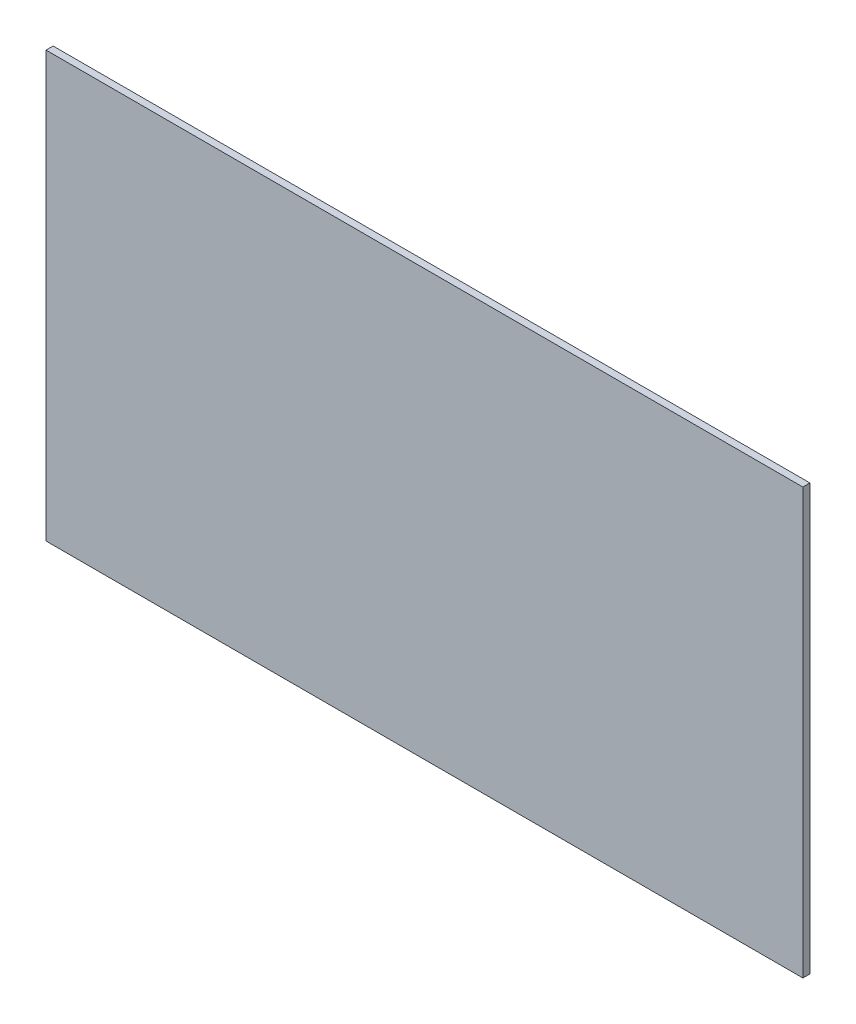
ISO-10303-21;
HEADER;
FILE_DESCRIPTION(('STEP AP214'),'2;1');
FILE_NAME('part.step','',(''),(''),'','','');
FILE_SCHEMA(('AUTOMOTIVE_DESIGN { 1 0 10303 214 1 1 1 1 }'));
ENDSEC;
DATA;
#1=APPLICATION_CONTEXT('core data for automotive mechanical design processes');
#2=APPLICATION_PROTOCOL_DEFINITION('international standard','automotive_design',2000,#1);
#3=PRODUCT_CONTEXT('',#1,'mechanical');
#4=PRODUCT('Part','Part','',(#3));
#5=PRODUCT_RELATED_PRODUCT_CATEGORY('part','',(#4));
#6=PRODUCT_DEFINITION_FORMATION('','',#4);
#7=PRODUCT_DEFINITION_CONTEXT('part definition',#1,'design');
#8=PRODUCT_DEFINITION('design','',#6,#7);
#9=PRODUCT_DEFINITION_SHAPE('','',#8);
#10=(LENGTH_UNIT() NAMED_UNIT(*) SI_UNIT(.MILLI.,.METRE.));
#11=(NAMED_UNIT(*) PLANE_ANGLE_UNIT() SI_UNIT($,.RADIAN.));
#12=(NAMED_UNIT(*) SI_UNIT($,.STERADIAN.) SOLID_ANGLE_UNIT());
#13=UNCERTAINTY_MEASURE_WITH_UNIT(LENGTH_MEASURE(1.E-05),#10,'distance_accuracy_value','');
#14=(GEOMETRIC_REPRESENTATION_CONTEXT(3) GLOBAL_UNCERTAINTY_ASSIGNED_CONTEXT((#13)) GLOBAL_UNIT_ASSIGNED_CONTEXT((#10,
#11,#12)) REPRESENTATION_CONTEXT('',''));
#15=CARTESIAN_POINT('',(0.,0.,0.));
#16=DIRECTION('',(0.,0.,1.));
#17=DIRECTION('',(1.,0.,0.));
#18=AXIS2_PLACEMENT_3D('',#15,#16,#17);
#19=CARTESIAN_POINT('',(267.,150.,5.));
#20=DIRECTION('',(-1.,0.,0.));
#21=DIRECTION('',(0.,0.,1.));
#22=AXIS2_PLACEMENT_3D('',#19,#20,#21);
#23=PLANE('',#22);
#24=DIRECTION('',(0.,1.,0.));
#25=VECTOR('',#24,1.);
#26=CARTESIAN_POINT('',(267.,150.,0.));
#27=LINE('',#26,#25);
#28=CARTESIAN_POINT('',(267.,-150.,0.));
#29=VERTEX_POINT('',#28);
#30=CARTESIAN_POINT('',(267.,150.,0.));
#31=VERTEX_POINT('',#30);
#32=EDGE_CURVE('E96',#29,#31,#27,.T.);
#33=ORIENTED_EDGE('',*,*,#32,.T.);
#34=DIRECTION('',(0.,0.,-1.));
#35=VECTOR('',#34,1.);
#36=CARTESIAN_POINT('',(267.,150.,5.));
#37=LINE('',#36,#35);
#38=CARTESIAN_POINT('',(267.,150.,5.));
#39=VERTEX_POINT('',#38);
#40=EDGE_CURVE('E11',#39,#31,#37,.T.);
#41=ORIENTED_EDGE('',*,*,#40,.F.);
#42=DIRECTION('',(0.,1.,0.));
#43=VECTOR('',#42,1.);
#44=CARTESIAN_POINT('',(267.,150.,5.));
#45=LINE('',#44,#43);
#46=CARTESIAN_POINT('',(267.,-150.,5.));
#47=VERTEX_POINT('',#46);
#48=EDGE_CURVE('E84',#47,#39,#45,.T.);
#49=ORIENTED_EDGE('',*,*,#48,.F.);
#50=DIRECTION('',(0.,0.,-1.));
#51=VECTOR('',#50,1.);
#52=CARTESIAN_POINT('',(267.,-150.,5.));
#53=LINE('',#52,#51);
#54=EDGE_CURVE('E92',#47,#29,#53,.T.);
#55=ORIENTED_EDGE('',*,*,#54,.T.);
#56=EDGE_LOOP('',(#33,#41,#49,#55));
#57=FACE_BOUND('',#56,.T.);
#58=ADVANCED_FACE('F33',(#57),#23,.F.);
#59=CARTESIAN_POINT('',(-267.,150.,5.));
#60=DIRECTION('',(0.,-1.,0.));
#61=DIRECTION('',(0.,0.,-1.));
#62=AXIS2_PLACEMENT_3D('',#59,#60,#61);
#63=PLANE('',#62);
#64=DIRECTION('',(-1.,0.,0.));
#65=VECTOR('',#64,1.);
#66=CARTESIAN_POINT('',(-267.,150.,0.));
#67=LINE('',#66,#65);
#68=CARTESIAN_POINT('',(-267.,150.,0.));
#69=VERTEX_POINT('',#68);
#70=EDGE_CURVE('E88',#31,#69,#67,.T.);
#71=ORIENTED_EDGE('',*,*,#70,.T.);
#72=DIRECTION('',(0.,0.,-1.));
#73=VECTOR('',#72,1.);
#74=CARTESIAN_POINT('',(-267.,150.,5.));
#75=LINE('',#74,#73);
#76=CARTESIAN_POINT('',(-267.,150.,5.));
#77=VERTEX_POINT('',#76);
#78=EDGE_CURVE('E41',#77,#69,#75,.T.);
#79=ORIENTED_EDGE('',*,*,#78,.F.);
#80=DIRECTION('',(-1.,0.,0.));
#81=VECTOR('',#80,1.);
#82=CARTESIAN_POINT('',(-267.,150.,5.));
#83=LINE('',#82,#81);
#84=EDGE_CURVE('E79',#39,#77,#83,.T.);
#85=ORIENTED_EDGE('',*,*,#84,.F.);
#86=ORIENTED_EDGE('',*,*,#40,.T.);
#87=EDGE_LOOP('',(#71,#79,#85,#86));
#88=FACE_BOUND('',#87,.T.);
#89=ADVANCED_FACE('F87',(#88),#63,.F.);
#90=CARTESIAN_POINT('',(-267.,150.,5.));
#91=DIRECTION('',(1.,0.,0.));
#92=DIRECTION('',(0.,0.,-1.));
#93=AXIS2_PLACEMENT_3D('',#90,#91,#92);
#94=PLANE('',#93);
#95=DIRECTION('',(0.,-1.,0.));
#96=VECTOR('',#95,1.);
#97=CARTESIAN_POINT('',(-267.,150.,0.));
#98=LINE('',#97,#96);
#99=CARTESIAN_POINT('',(-267.,-150.,0.));
#100=VERTEX_POINT('',#99);
#101=EDGE_CURVE('E66',#69,#100,#98,.T.);
#102=ORIENTED_EDGE('',*,*,#101,.T.);
#103=DIRECTION('',(0.,0.,-1.));
#104=VECTOR('',#103,1.);
#105=CARTESIAN_POINT('',(-267.,-150.,5.));
#106=LINE('',#105,#104);
#107=CARTESIAN_POINT('',(-267.,-150.,5.));
#108=VERTEX_POINT('',#107);
#109=EDGE_CURVE('E89',#108,#100,#106,.T.);
#110=ORIENTED_EDGE('',*,*,#109,.F.);
#111=DIRECTION('',(0.,-1.,0.));
#112=VECTOR('',#111,1.);
#113=CARTESIAN_POINT('',(-267.,150.,5.));
#114=LINE('',#113,#112);
#115=EDGE_CURVE('E82',#77,#108,#114,.T.);
#116=ORIENTED_EDGE('',*,*,#115,.F.);
#117=ORIENTED_EDGE('',*,*,#78,.T.);
#118=EDGE_LOOP('',(#102,#110,#116,#117));
#119=FACE_BOUND('',#118,.T.);
#120=ADVANCED_FACE('F90',(#119),#94,.F.);
#121=CARTESIAN_POINT('',(-267.,-150.,5.));
#122=DIRECTION('',(0.,1.,0.));
#123=DIRECTION('',(0.,0.,1.));
#124=AXIS2_PLACEMENT_3D('',#121,#122,#123);
#125=PLANE('',#124);
#126=DIRECTION('',(1.,0.,0.));
#127=VECTOR('',#126,1.);
#128=CARTESIAN_POINT('',(-267.,-150.,0.));
#129=LINE('',#128,#127);
#130=EDGE_CURVE('E72',#100,#29,#129,.T.);
#131=ORIENTED_EDGE('',*,*,#130,.T.);
#132=ORIENTED_EDGE('',*,*,#54,.F.);
#133=DIRECTION('',(1.,0.,0.));
#134=VECTOR('',#133,1.);
#135=CARTESIAN_POINT('',(-267.,-150.,5.));
#136=LINE('',#135,#134);
#137=EDGE_CURVE('E49',#108,#47,#136,.T.);
#138=ORIENTED_EDGE('',*,*,#137,.F.);
#139=ORIENTED_EDGE('',*,*,#109,.T.);
#140=EDGE_LOOP('',(#131,#132,#138,#139));
#141=FACE_BOUND('',#140,.T.);
#142=ADVANCED_FACE('F103',(#141),#125,.F.);
#143=CARTESIAN_POINT('',(0.,0.,5.));
#144=DIRECTION('',(0.,0.,1.));
#145=DIRECTION('',(1.,0.,0.));
#146=AXIS2_PLACEMENT_3D('',#143,#144,#145);
#147=PLANE('',#146);
#148=ORIENTED_EDGE('',*,*,#48,.T.);
#149=ORIENTED_EDGE('',*,*,#84,.T.);
#150=ORIENTED_EDGE('',*,*,#115,.T.);
#151=ORIENTED_EDGE('',*,*,#137,.T.);
#152=EDGE_LOOP('',(#148,#149,#150,#151));
#153=FACE_BOUND('',#152,.T.);
#154=ADVANCED_FACE('F80',(#153),#147,.T.);
#155=CARTESIAN_POINT('',(0.,0.,0.));
#156=DIRECTION('',(0.,0.,1.));
#157=DIRECTION('',(1.,0.,0.));
#158=AXIS2_PLACEMENT_3D('',#155,#156,#157);
#159=PLANE('',#158);
#160=ORIENTED_EDGE('',*,*,#32,.F.);
#161=ORIENTED_EDGE('',*,*,#130,.F.);
#162=ORIENTED_EDGE('',*,*,#101,.F.);
#163=ORIENTED_EDGE('',*,*,#70,.F.);
#164=EDGE_LOOP('',(#160,#161,#162,#163));
#165=FACE_BOUND('',#164,.T.);
#166=ADVANCED_FACE('F106',(#165),#159,.F.);
#167=CLOSED_SHELL('',(#58,#89,#120,#142,#154,#166));
#168=MANIFOLD_SOLID_BREP('B2',#167);
#169=ADVANCED_BREP_SHAPE_REPRESENTATION('',(#18,#168),#14);
#170=SHAPE_DEFINITION_REPRESENTATION(#9,#169);
ENDSEC;
END-ISO-10303-21;
